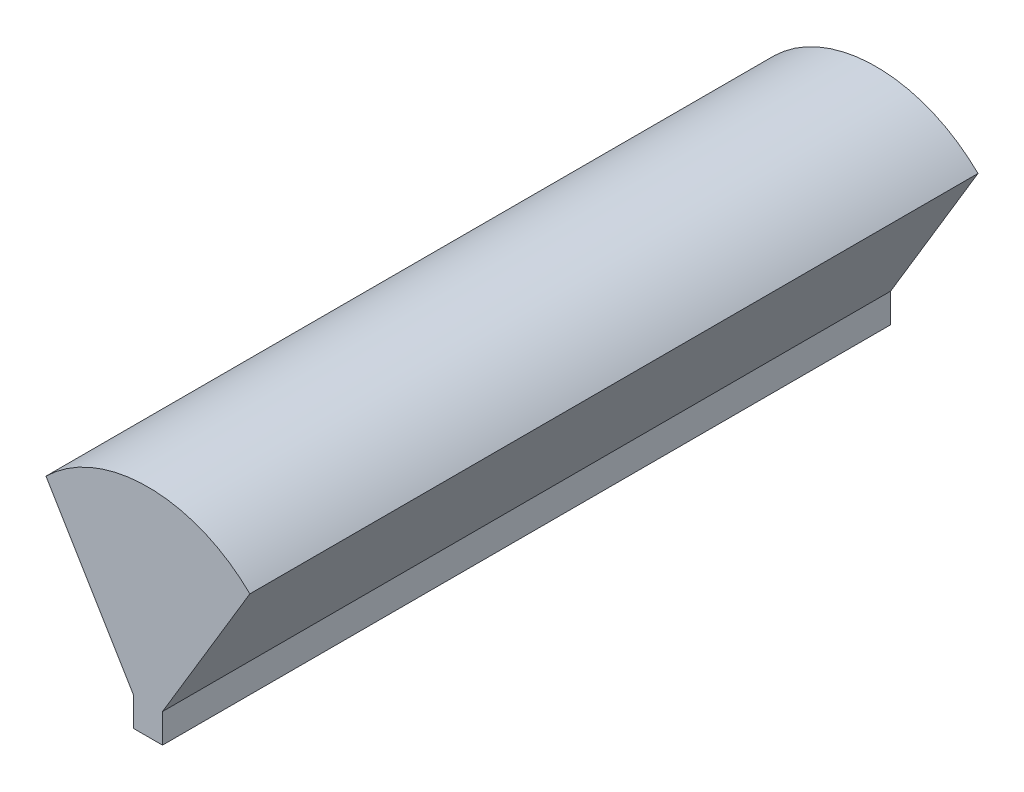
ISO-10303-21;
HEADER;
FILE_DESCRIPTION(('STEP AP214'),'2;1');
FILE_NAME('part.step','',(''),(''),'','','');
FILE_SCHEMA(('AUTOMOTIVE_DESIGN { 1 0 10303 214 1 1 1 1 }'));
ENDSEC;
DATA;
#1=APPLICATION_CONTEXT('core data for automotive mechanical design processes');
#2=APPLICATION_PROTOCOL_DEFINITION('international standard','automotive_design',2000,#1);
#3=PRODUCT_CONTEXT('',#1,'mechanical');
#4=PRODUCT('Part','Part','',(#3));
#5=PRODUCT_RELATED_PRODUCT_CATEGORY('part','',(#4));
#6=PRODUCT_DEFINITION_FORMATION('','',#4);
#7=PRODUCT_DEFINITION_CONTEXT('part definition',#1,'design');
#8=PRODUCT_DEFINITION('design','',#6,#7);
#9=PRODUCT_DEFINITION_SHAPE('','',#8);
#10=(LENGTH_UNIT() NAMED_UNIT(*) SI_UNIT(.MILLI.,.METRE.));
#11=(NAMED_UNIT(*) PLANE_ANGLE_UNIT() SI_UNIT($,.RADIAN.));
#12=(NAMED_UNIT(*) SI_UNIT($,.STERADIAN.) SOLID_ANGLE_UNIT());
#13=UNCERTAINTY_MEASURE_WITH_UNIT(LENGTH_MEASURE(1.E-05),#10,'distance_accuracy_value','');
#14=(GEOMETRIC_REPRESENTATION_CONTEXT(3) GLOBAL_UNCERTAINTY_ASSIGNED_CONTEXT((#13)) GLOBAL_UNIT_ASSIGNED_CONTEXT((#10,
#11,#12)) REPRESENTATION_CONTEXT('',''));
#15=CARTESIAN_POINT('',(0.,0.,0.));
#16=DIRECTION('',(0.,0.,1.));
#17=DIRECTION('',(1.,0.,0.));
#18=AXIS2_PLACEMENT_3D('',#15,#16,#17);
#19=CARTESIAN_POINT('',(0.,2.,50.));
#20=DIRECTION('',(1.,0.,0.));
#21=DIRECTION('',(0.,1.,0.));
#22=AXIS2_PLACEMENT_3D('',#19,#20,#21);
#23=PLANE('',#22);
#24=DIRECTION('',(0.,-1.,0.));
#25=VECTOR('',#24,1.);
#26=CARTESIAN_POINT('',(0.,2.,0.));
#27=LINE('',#26,#25);
#28=CARTESIAN_POINT('',(0.,2.,0.));
#29=VERTEX_POINT('',#28);
#30=CARTESIAN_POINT('',(0.,0.,0.));
#31=VERTEX_POINT('',#30);
#32=EDGE_CURVE('E128',#29,#31,#27,.T.);
#33=ORIENTED_EDGE('',*,*,#32,.T.);
#34=DIRECTION('',(0.,0.,-1.));
#35=VECTOR('',#34,1.);
#36=CARTESIAN_POINT('',(0.,0.,50.));
#37=LINE('',#36,#35);
#38=CARTESIAN_POINT('',(0.,0.,50.));
#39=VERTEX_POINT('',#38);
#40=EDGE_CURVE('E11',#39,#31,#37,.T.);
#41=ORIENTED_EDGE('',*,*,#40,.F.);
#42=DIRECTION('',(0.,-1.,0.));
#43=VECTOR('',#42,1.);
#44=CARTESIAN_POINT('',(0.,2.,50.));
#45=LINE('',#44,#43);
#46=CARTESIAN_POINT('',(0.,2.,50.));
#47=VERTEX_POINT('',#46);
#48=EDGE_CURVE('E131',#47,#39,#45,.T.);
#49=ORIENTED_EDGE('',*,*,#48,.F.);
#50=DIRECTION('',(0.,0.,-1.));
#51=VECTOR('',#50,1.);
#52=CARTESIAN_POINT('',(0.,2.,50.));
#53=LINE('',#52,#51);
#54=EDGE_CURVE('E140',#47,#29,#53,.T.);
#55=ORIENTED_EDGE('',*,*,#54,.T.);
#56=EDGE_LOOP('',(#33,#41,#49,#55));
#57=FACE_BOUND('',#56,.T.);
#58=ADVANCED_FACE('F43',(#57),#23,.F.);
#59=CARTESIAN_POINT('',(0.,0.,50.));
#60=DIRECTION('',(0.,1.,0.));
#61=DIRECTION('',(0.,0.,1.));
#62=AXIS2_PLACEMENT_3D('',#59,#60,#61);
#63=PLANE('',#62);
#64=DIRECTION('',(1.,0.,0.));
#65=VECTOR('',#64,1.);
#66=CARTESIAN_POINT('',(0.,0.,0.));
#67=LINE('',#66,#65);
#68=CARTESIAN_POINT('',(2.,0.,0.));
#69=VERTEX_POINT('',#68);
#70=EDGE_CURVE('E144',#31,#69,#67,.T.);
#71=ORIENTED_EDGE('',*,*,#70,.T.);
#72=DIRECTION('',(0.,0.,-1.));
#73=VECTOR('',#72,1.);
#74=CARTESIAN_POINT('',(2.,0.,50.));
#75=LINE('',#74,#73);
#76=CARTESIAN_POINT('',(2.,0.,50.));
#77=VERTEX_POINT('',#76);
#78=EDGE_CURVE('E52',#77,#69,#75,.T.);
#79=ORIENTED_EDGE('',*,*,#78,.F.);
#80=DIRECTION('',(1.,0.,0.));
#81=VECTOR('',#80,1.);
#82=CARTESIAN_POINT('',(0.,0.,50.));
#83=LINE('',#82,#81);
#84=EDGE_CURVE('E96',#39,#77,#83,.T.);
#85=ORIENTED_EDGE('',*,*,#84,.F.);
#86=ORIENTED_EDGE('',*,*,#40,.T.);
#87=EDGE_LOOP('',(#71,#79,#85,#86));
#88=FACE_BOUND('',#87,.T.);
#89=ADVANCED_FACE('F171',(#88),#63,.F.);
#90=CARTESIAN_POINT('',(2.,0.,50.));
#91=DIRECTION('',(-1.,0.,0.));
#92=DIRECTION('',(0.,0.,1.));
#93=AXIS2_PLACEMENT_3D('',#90,#91,#92);
#94=PLANE('',#93);
#95=DIRECTION('',(0.,1.,0.));
#96=VECTOR('',#95,1.);
#97=CARTESIAN_POINT('',(2.,0.,0.));
#98=LINE('',#97,#96);
#99=CARTESIAN_POINT('',(2.,2.,0.));
#100=VERTEX_POINT('',#99);
#101=EDGE_CURVE('E147',#69,#100,#98,.T.);
#102=ORIENTED_EDGE('',*,*,#101,.T.);
#103=DIRECTION('',(0.,0.,-1.));
#104=VECTOR('',#103,1.);
#105=CARTESIAN_POINT('',(2.,2.,50.));
#106=LINE('',#105,#104);
#107=CARTESIAN_POINT('',(2.,2.,50.));
#108=VERTEX_POINT('',#107);
#109=EDGE_CURVE('E119',#108,#100,#106,.T.);
#110=ORIENTED_EDGE('',*,*,#109,.F.);
#111=DIRECTION('',(0.,1.,0.));
#112=VECTOR('',#111,1.);
#113=CARTESIAN_POINT('',(2.,0.,50.));
#114=LINE('',#113,#112);
#115=EDGE_CURVE('E109',#77,#108,#114,.T.);
#116=ORIENTED_EDGE('',*,*,#115,.F.);
#117=ORIENTED_EDGE('',*,*,#78,.T.);
#118=EDGE_LOOP('',(#102,#110,#116,#117));
#119=FACE_BOUND('',#118,.T.);
#120=ADVANCED_FACE('F163',(#119),#94,.F.);
#121=CARTESIAN_POINT('',(2.,2.,50.));
#122=DIRECTION('',(-0.857492925712544,0.514495755427526,0.));
#123=DIRECTION('',(-0.514495755427526,-0.857492925712544,0.));
#124=AXIS2_PLACEMENT_3D('',#121,#122,#123);
#125=PLANE('',#124);
#126=DIRECTION('',(0.514495755427526,0.857492925712544,0.));
#127=VECTOR('',#126,1.);
#128=CARTESIAN_POINT('',(2.,2.,0.));
#129=LINE('',#128,#127);
#130=CARTESIAN_POINT('',(8.,12.,0.));
#131=VERTEX_POINT('',#130);
#132=EDGE_CURVE('E81',#100,#131,#129,.T.);
#133=ORIENTED_EDGE('',*,*,#132,.T.);
#134=DIRECTION('',(0.,0.,-1.));
#135=VECTOR('',#134,1.);
#136=CARTESIAN_POINT('',(8.,12.,50.));
#137=LINE('',#136,#135);
#138=CARTESIAN_POINT('',(8.,12.,50.));
#139=VERTEX_POINT('',#138);
#140=EDGE_CURVE('E113',#139,#131,#137,.T.);
#141=ORIENTED_EDGE('',*,*,#140,.F.);
#142=DIRECTION('',(0.514495755427526,0.857492925712544,0.));
#143=VECTOR('',#142,1.);
#144=CARTESIAN_POINT('',(2.,2.,50.));
#145=LINE('',#144,#143);
#146=EDGE_CURVE('E104',#108,#139,#145,.T.);
#147=ORIENTED_EDGE('',*,*,#146,.F.);
#148=ORIENTED_EDGE('',*,*,#109,.T.);
#149=EDGE_LOOP('',(#133,#141,#147,#148));
#150=FACE_BOUND('',#149,.T.);
#151=ADVANCED_FACE('F114',(#150),#125,.F.);
#152=CARTESIAN_POINT('',(-6.,12.,50.));
#153=DIRECTION('',(0.857492925712544,0.514495755427527,0.));
#154=DIRECTION('',(-0.514495755427527,0.857492925712544,0.));
#155=AXIS2_PLACEMENT_3D('',#152,#153,#154);
#156=PLANE('',#155);
#157=DIRECTION('',(0.514495755427527,-0.857492925712544,0.));
#158=VECTOR('',#157,1.);
#159=CARTESIAN_POINT('',(-6.,12.,0.));
#160=LINE('',#159,#158);
#161=CARTESIAN_POINT('',(-6.,12.,0.));
#162=VERTEX_POINT('',#161);
#163=EDGE_CURVE('E88',#162,#29,#160,.T.);
#164=ORIENTED_EDGE('',*,*,#163,.T.);
#165=ORIENTED_EDGE('',*,*,#54,.F.);
#166=DIRECTION('',(0.514495755427527,-0.857492925712544,0.));
#167=VECTOR('',#166,1.);
#168=CARTESIAN_POINT('',(-6.,12.,50.));
#169=LINE('',#168,#167);
#170=CARTESIAN_POINT('',(-6.,12.,50.));
#171=VERTEX_POINT('',#170);
#172=EDGE_CURVE('E60',#171,#47,#169,.T.);
#173=ORIENTED_EDGE('',*,*,#172,.F.);
#174=DIRECTION('',(0.,0.,-1.));
#175=VECTOR('',#174,1.);
#176=CARTESIAN_POINT('',(-6.,12.,50.));
#177=LINE('',#176,#175);
#178=EDGE_CURVE('E120',#171,#162,#177,.T.);
#179=ORIENTED_EDGE('',*,*,#178,.T.);
#180=EDGE_LOOP('',(#164,#165,#173,#179));
#181=FACE_BOUND('',#180,.T.);
#182=ADVANCED_FACE('F167',(#181),#156,.F.);
#183=CARTESIAN_POINT('',(0.,0.,50.));
#184=DIRECTION('',(0.,0.,1.));
#185=DIRECTION('',(1.,0.,0.));
#186=AXIS2_PLACEMENT_3D('',#183,#184,#185);
#187=PLANE('',#186);
#188=ORIENTED_EDGE('',*,*,#48,.T.);
#189=ORIENTED_EDGE('',*,*,#84,.T.);
#190=ORIENTED_EDGE('',*,*,#115,.T.);
#191=ORIENTED_EDGE('',*,*,#146,.T.);
#192=CARTESIAN_POINT('',(1.,4.85857157145715,50.));
#193=DIRECTION('',(0.,0.,1.));
#194=DIRECTION('',(-1.,0.,0.));
#195=AXIS2_PLACEMENT_3D('',#192,#193,#194);
#196=CIRCLE('',#195,10.);
#197=EDGE_CURVE('E107',#139,#171,#196,.T.);
#198=ORIENTED_EDGE('',*,*,#197,.T.);
#199=ORIENTED_EDGE('',*,*,#172,.T.);
#200=EDGE_LOOP('',(#188,#189,#190,#191,#198,#199));
#201=FACE_BOUND('',#200,.T.);
#202=ADVANCED_FACE('F105',(#201),#187,.T.);
#203=CARTESIAN_POINT('',(0.,0.,0.));
#204=DIRECTION('',(0.,0.,1.));
#205=DIRECTION('',(1.,0.,0.));
#206=AXIS2_PLACEMENT_3D('',#203,#204,#205);
#207=PLANE('',#206);
#208=ORIENTED_EDGE('',*,*,#32,.F.);
#209=ORIENTED_EDGE('',*,*,#163,.F.);
#210=CARTESIAN_POINT('',(1.,4.85857157145715,0.));
#211=DIRECTION('',(0.,0.,1.));
#212=DIRECTION('',(-1.,0.,0.));
#213=AXIS2_PLACEMENT_3D('',#210,#211,#212);
#214=CIRCLE('',#213,10.);
#215=EDGE_CURVE('E125',#131,#162,#214,.T.);
#216=ORIENTED_EDGE('',*,*,#215,.F.);
#217=ORIENTED_EDGE('',*,*,#132,.F.);
#218=ORIENTED_EDGE('',*,*,#101,.F.);
#219=ORIENTED_EDGE('',*,*,#70,.F.);
#220=EDGE_LOOP('',(#208,#209,#216,#217,#218,#219));
#221=FACE_BOUND('',#220,.T.);
#222=ADVANCED_FACE('F166',(#221),#207,.F.);
#223=CARTESIAN_POINT('',(1.,4.85857157145715,0.));
#224=DIRECTION('',(0.,0.,1.));
#225=DIRECTION('',(1.,0.,0.));
#226=AXIS2_PLACEMENT_3D('',#223,#224,#225);
#227=CYLINDRICAL_SURFACE('',#226,10.);
#228=ORIENTED_EDGE('',*,*,#197,.F.);
#229=ORIENTED_EDGE('',*,*,#140,.T.);
#230=ORIENTED_EDGE('',*,*,#215,.T.);
#231=ORIENTED_EDGE('',*,*,#178,.F.);
#232=EDGE_LOOP('',(#228,#229,#230,#231));
#233=FACE_BOUND('',#232,.T.);
#234=ADVANCED_FACE('F123',(#233),#227,.T.);
#235=CLOSED_SHELL('',(#58,#89,#120,#151,#182,#202,#222,#234));
#236=MANIFOLD_SOLID_BREP('B2',#235);
#237=ADVANCED_BREP_SHAPE_REPRESENTATION('',(#18,#236),#14);
#238=SHAPE_DEFINITION_REPRESENTATION(#9,#237);
ENDSEC;
END-ISO-10303-21;
